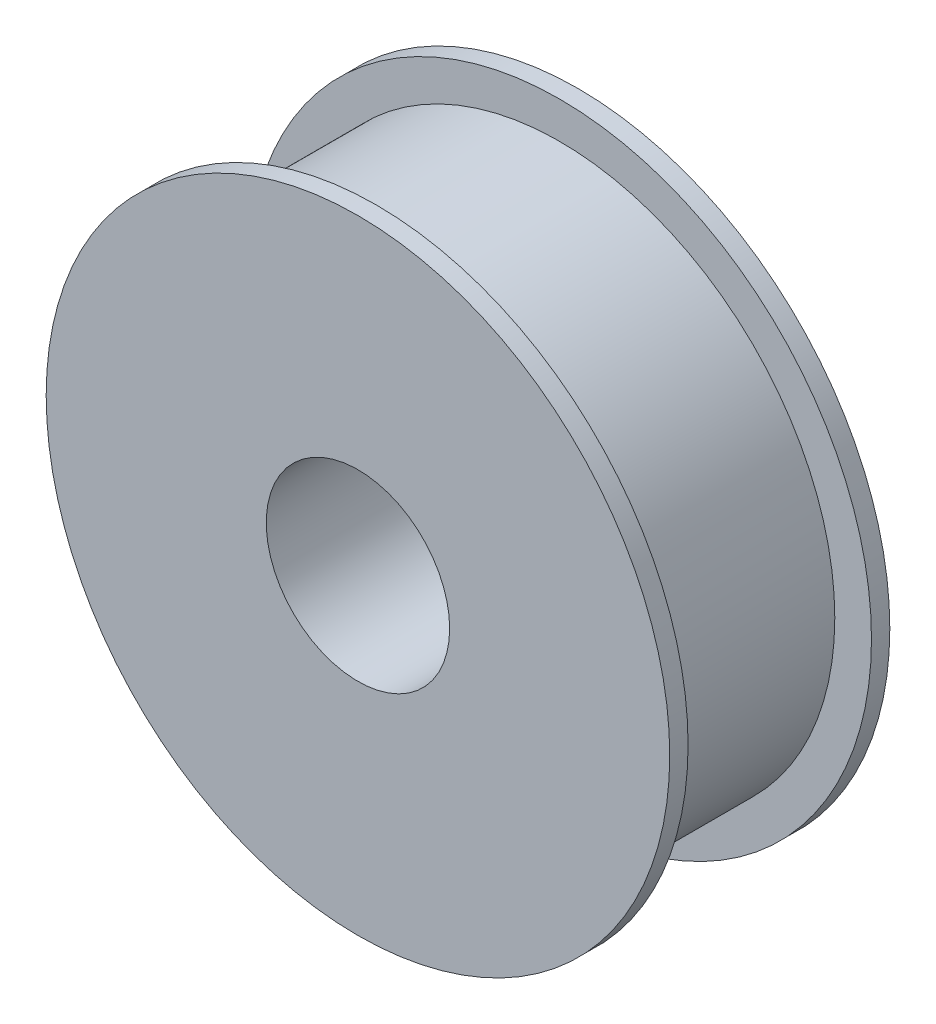
ISO-10303-21;
HEADER;
FILE_DESCRIPTION(('STEP AP214'),'2;1');
FILE_NAME('part.step','',(''),(''),'','','');
FILE_SCHEMA(('AUTOMOTIVE_DESIGN { 1 0 10303 214 1 1 1 1 }'));
ENDSEC;
DATA;
#1=APPLICATION_CONTEXT('core data for automotive mechanical design processes');
#2=APPLICATION_PROTOCOL_DEFINITION('international standard','automotive_design',2000,#1);
#3=PRODUCT_CONTEXT('',#1,'mechanical');
#4=PRODUCT('Part','Part','',(#3));
#5=PRODUCT_RELATED_PRODUCT_CATEGORY('part','',(#4));
#6=PRODUCT_DEFINITION_FORMATION('','',#4);
#7=PRODUCT_DEFINITION_CONTEXT('part definition',#1,'design');
#8=PRODUCT_DEFINITION('design','',#6,#7);
#9=PRODUCT_DEFINITION_SHAPE('','',#8);
#10=(LENGTH_UNIT() NAMED_UNIT(*) SI_UNIT(.MILLI.,.METRE.));
#11=(NAMED_UNIT(*) PLANE_ANGLE_UNIT() SI_UNIT($,.RADIAN.));
#12=(NAMED_UNIT(*) SI_UNIT($,.STERADIAN.) SOLID_ANGLE_UNIT());
#13=UNCERTAINTY_MEASURE_WITH_UNIT(LENGTH_MEASURE(1.E-05),#10,'distance_accuracy_value','');
#14=(GEOMETRIC_REPRESENTATION_CONTEXT(3) GLOBAL_UNCERTAINTY_ASSIGNED_CONTEXT((#13)) GLOBAL_UNIT_ASSIGNED_CONTEXT((#10,
#11,#12)) REPRESENTATION_CONTEXT('',''));
#15=CARTESIAN_POINT('',(0.,0.,0.));
#16=DIRECTION('',(0.,0.,1.));
#17=DIRECTION('',(1.,0.,0.));
#18=AXIS2_PLACEMENT_3D('',#15,#16,#17);
#19=CARTESIAN_POINT('',(0.,17.,6.));
#20=DIRECTION('',(0.,0.,-1.));
#21=DIRECTION('',(-1.,0.,0.));
#22=AXIS2_PLACEMENT_3D('',#19,#20,#21);
#23=PLANE('',#22);
#24=CARTESIAN_POINT('',(0.,0.,6.));
#25=DIRECTION('',(0.,0.,1.));
#26=DIRECTION('',(1.,0.,0.));
#27=AXIS2_PLACEMENT_3D('',#24,#25,#26);
#28=CIRCLE('',#27,5.);
#29=CARTESIAN_POINT('',(5.,0.,6.));
#30=VERTEX_POINT('',#29);
#31=EDGE_CURVE('E60',#30,#30,#28,.T.);
#32=ORIENTED_EDGE('',*,*,#31,.F.);
#33=EDGE_LOOP('',(#32));
#34=FACE_BOUND('',#33,.T.);
#35=CARTESIAN_POINT('',(0.,0.,6.));
#36=DIRECTION('',(0.,0.,1.));
#37=DIRECTION('',(1.,0.,0.));
#38=AXIS2_PLACEMENT_3D('',#35,#36,#37);
#39=CIRCLE('',#38,17.);
#40=CARTESIAN_POINT('',(17.,0.,6.));
#41=VERTEX_POINT('',#40);
#42=EDGE_CURVE('E54',#41,#41,#39,.T.);
#43=ORIENTED_EDGE('',*,*,#42,.T.);
#44=EDGE_LOOP('',(#43));
#45=FACE_BOUND('',#44,.T.);
#46=ADVANCED_FACE('F32',(#34,#45),#23,.F.);
#47=CARTESIAN_POINT('',(0.,17.,-6.));
#48=DIRECTION('',(0.,0.,1.));
#49=DIRECTION('',(1.,0.,0.));
#50=AXIS2_PLACEMENT_3D('',#47,#48,#49);
#51=PLANE('',#50);
#52=CARTESIAN_POINT('',(0.,0.,-6.));
#53=DIRECTION('',(0.,0.,1.));
#54=DIRECTION('',(1.,0.,0.));
#55=AXIS2_PLACEMENT_3D('',#52,#53,#54);
#56=CIRCLE('',#55,5.);
#57=CARTESIAN_POINT('',(5.,0.,-6.));
#58=VERTEX_POINT('',#57);
#59=EDGE_CURVE('E57',#58,#58,#56,.T.);
#60=ORIENTED_EDGE('',*,*,#59,.T.);
#61=EDGE_LOOP('',(#60));
#62=FACE_BOUND('',#61,.T.);
#63=CARTESIAN_POINT('',(0.,0.,-6.));
#64=DIRECTION('',(0.,0.,1.));
#65=DIRECTION('',(1.,0.,0.));
#66=AXIS2_PLACEMENT_3D('',#63,#64,#65);
#67=CIRCLE('',#66,17.);
#68=CARTESIAN_POINT('',(17.,0.,-6.));
#69=VERTEX_POINT('',#68);
#70=EDGE_CURVE('E10',#69,#69,#67,.T.);
#71=ORIENTED_EDGE('',*,*,#70,.F.);
#72=EDGE_LOOP('',(#71));
#73=FACE_BOUND('',#72,.T.);
#74=ADVANCED_FACE('F68',(#62,#73),#51,.F.);
#75=CARTESIAN_POINT('',(0.,0.,6.));
#76=DIRECTION('',(0.,0.,1.));
#77=DIRECTION('',(1.,0.,0.));
#78=AXIS2_PLACEMENT_3D('',#75,#76,#77);
#79=CYLINDRICAL_SURFACE('',#78,17.);
#80=CARTESIAN_POINT('',(0.,0.,-5.));
#81=DIRECTION('',(0.,0.,1.));
#82=DIRECTION('',(1.,0.,0.));
#83=AXIS2_PLACEMENT_3D('',#80,#81,#82);
#84=CIRCLE('',#83,17.);
#85=CARTESIAN_POINT('',(17.,0.,-5.));
#86=VERTEX_POINT('',#85);
#87=EDGE_CURVE('E38',#86,#86,#84,.T.);
#88=ORIENTED_EDGE('',*,*,#87,.F.);
#89=EDGE_LOOP('',(#88));
#90=FACE_BOUND('',#89,.T.);
#91=ORIENTED_EDGE('',*,*,#70,.T.);
#92=EDGE_LOOP('',(#91));
#93=FACE_BOUND('',#92,.T.);
#94=ADVANCED_FACE('F91',(#90,#93),#79,.T.);
#95=CARTESIAN_POINT('',(0.,15.,-5.));
#96=DIRECTION('',(0.,0.,-1.));
#97=DIRECTION('',(-1.,0.,0.));
#98=AXIS2_PLACEMENT_3D('',#95,#96,#97);
#99=PLANE('',#98);
#100=CARTESIAN_POINT('',(0.,0.,-5.));
#101=DIRECTION('',(0.,0.,1.));
#102=DIRECTION('',(1.,0.,0.));
#103=AXIS2_PLACEMENT_3D('',#100,#101,#102);
#104=CIRCLE('',#103,15.);
#105=CARTESIAN_POINT('',(15.,0.,-5.));
#106=VERTEX_POINT('',#105);
#107=EDGE_CURVE('E42',#106,#106,#104,.T.);
#108=ORIENTED_EDGE('',*,*,#107,.F.);
#109=EDGE_LOOP('',(#108));
#110=FACE_BOUND('',#109,.T.);
#111=ORIENTED_EDGE('',*,*,#87,.T.);
#112=EDGE_LOOP('',(#111));
#113=FACE_BOUND('',#112,.T.);
#114=ADVANCED_FACE('F86',(#110,#113),#99,.F.);
#115=CARTESIAN_POINT('',(0.,0.,6.));
#116=DIRECTION('',(0.,0.,1.));
#117=DIRECTION('',(1.,0.,0.));
#118=AXIS2_PLACEMENT_3D('',#115,#116,#117);
#119=CYLINDRICAL_SURFACE('',#118,15.);
#120=CARTESIAN_POINT('',(0.,0.,5.));
#121=DIRECTION('',(0.,0.,1.));
#122=DIRECTION('',(1.,0.,0.));
#123=AXIS2_PLACEMENT_3D('',#120,#121,#122);
#124=CIRCLE('',#123,15.);
#125=CARTESIAN_POINT('',(15.,0.,5.));
#126=VERTEX_POINT('',#125);
#127=EDGE_CURVE('E46',#126,#126,#124,.T.);
#128=ORIENTED_EDGE('',*,*,#127,.F.);
#129=EDGE_LOOP('',(#128));
#130=FACE_BOUND('',#129,.T.);
#131=ORIENTED_EDGE('',*,*,#107,.T.);
#132=EDGE_LOOP('',(#131));
#133=FACE_BOUND('',#132,.T.);
#134=ADVANCED_FACE('F80',(#130,#133),#119,.T.);
#135=CARTESIAN_POINT('',(0.,17.,5.));
#136=DIRECTION('',(0.,0.,1.));
#137=DIRECTION('',(1.,0.,0.));
#138=AXIS2_PLACEMENT_3D('',#135,#136,#137);
#139=PLANE('',#138);
#140=CARTESIAN_POINT('',(0.,0.,5.));
#141=DIRECTION('',(0.,0.,1.));
#142=DIRECTION('',(1.,0.,0.));
#143=AXIS2_PLACEMENT_3D('',#140,#141,#142);
#144=CIRCLE('',#143,17.);
#145=CARTESIAN_POINT('',(17.,0.,5.));
#146=VERTEX_POINT('',#145);
#147=EDGE_CURVE('E51',#146,#146,#144,.T.);
#148=ORIENTED_EDGE('',*,*,#147,.F.);
#149=EDGE_LOOP('',(#148));
#150=FACE_BOUND('',#149,.T.);
#151=ORIENTED_EDGE('',*,*,#127,.T.);
#152=EDGE_LOOP('',(#151));
#153=FACE_BOUND('',#152,.T.);
#154=ADVANCED_FACE('F74',(#150,#153),#139,.F.);
#155=CARTESIAN_POINT('',(0.,0.,6.));
#156=DIRECTION('',(0.,0.,1.));
#157=DIRECTION('',(1.,0.,0.));
#158=AXIS2_PLACEMENT_3D('',#155,#156,#157);
#159=CYLINDRICAL_SURFACE('',#158,17.);
#160=ORIENTED_EDGE('',*,*,#42,.F.);
#161=EDGE_LOOP('',(#160));
#162=FACE_BOUND('',#161,.T.);
#163=ORIENTED_EDGE('',*,*,#147,.T.);
#164=EDGE_LOOP('',(#163));
#165=FACE_BOUND('',#164,.T.);
#166=ADVANCED_FACE('F71',(#162,#165),#159,.T.);
#167=CARTESIAN_POINT('',(0.,0.,-6.));
#168=DIRECTION('',(0.,0.,1.));
#169=DIRECTION('',(1.,0.,0.));
#170=AXIS2_PLACEMENT_3D('',#167,#168,#169);
#171=CYLINDRICAL_SURFACE('',#170,5.);
#172=CARTESIAN_POINT('',(5.,0.,-6.));
#173=CARTESIAN_POINT('',(5.,0.,-5.875));
#174=CARTESIAN_POINT('',(5.,0.,-5.75));
#175=CARTESIAN_POINT('',(5.,0.,-5.5));
#176=CARTESIAN_POINT('',(5.,0.,-5.375));
#177=CARTESIAN_POINT('',(5.,0.,-5.125));
#178=CARTESIAN_POINT('',(5.,0.,-5.));
#179=CARTESIAN_POINT('',(5.,0.,-4.75));
#180=CARTESIAN_POINT('',(5.,0.,-4.625));
#181=CARTESIAN_POINT('',(5.,0.,-4.375));
#182=CARTESIAN_POINT('',(5.,0.,-4.25));
#183=CARTESIAN_POINT('',(5.,0.,-4.));
#184=CARTESIAN_POINT('',(5.,0.,-3.875));
#185=CARTESIAN_POINT('',(5.,0.,-3.625));
#186=CARTESIAN_POINT('',(5.,0.,-3.5));
#187=CARTESIAN_POINT('',(5.,0.,-3.25));
#188=CARTESIAN_POINT('',(5.,0.,-3.125));
#189=CARTESIAN_POINT('',(5.,0.,-2.875));
#190=CARTESIAN_POINT('',(5.,0.,-2.75));
#191=CARTESIAN_POINT('',(5.,0.,-2.5));
#192=CARTESIAN_POINT('',(5.,0.,-2.375));
#193=CARTESIAN_POINT('',(5.,0.,-2.125));
#194=CARTESIAN_POINT('',(5.,0.,-2.));
#195=CARTESIAN_POINT('',(5.,0.,-1.75));
#196=CARTESIAN_POINT('',(5.,0.,-1.625));
#197=CARTESIAN_POINT('',(5.,0.,-1.375));
#198=CARTESIAN_POINT('',(5.,0.,-1.25));
#199=CARTESIAN_POINT('',(5.,0.,-1.));
#200=CARTESIAN_POINT('',(5.,0.,-0.875000000000001));
#201=CARTESIAN_POINT('',(5.,0.,-0.625000000000001));
#202=CARTESIAN_POINT('',(5.,0.,-0.500000000000001));
#203=CARTESIAN_POINT('',(5.,0.,-0.250000000000001));
#204=CARTESIAN_POINT('',(5.,0.,-0.125000000000001));
#205=CARTESIAN_POINT('',(5.,0.,0.124999999999999));
#206=CARTESIAN_POINT('',(5.,0.,0.249999999999999));
#207=CARTESIAN_POINT('',(5.,0.,0.5));
#208=CARTESIAN_POINT('',(5.,0.,0.625));
#209=CARTESIAN_POINT('',(5.,0.,0.875));
#210=CARTESIAN_POINT('',(5.,0.,0.999999999999999));
#211=CARTESIAN_POINT('',(5.,0.,1.25));
#212=CARTESIAN_POINT('',(5.,0.,1.375));
#213=CARTESIAN_POINT('',(5.,0.,1.625));
#214=CARTESIAN_POINT('',(5.,0.,1.75));
#215=CARTESIAN_POINT('',(5.,0.,2.));
#216=CARTESIAN_POINT('',(5.,0.,2.125));
#217=CARTESIAN_POINT('',(5.,0.,2.375));
#218=CARTESIAN_POINT('',(5.,0.,2.5));
#219=CARTESIAN_POINT('',(5.,0.,2.75));
#220=CARTESIAN_POINT('',(5.,0.,2.875));
#221=CARTESIAN_POINT('',(5.,0.,3.125));
#222=CARTESIAN_POINT('',(5.,0.,3.25));
#223=CARTESIAN_POINT('',(5.,0.,3.5));
#224=CARTESIAN_POINT('',(5.,0.,3.625));
#225=CARTESIAN_POINT('',(5.,0.,3.875));
#226=CARTESIAN_POINT('',(5.,0.,4.));
#227=CARTESIAN_POINT('',(5.,0.,4.25));
#228=CARTESIAN_POINT('',(5.,0.,4.375));
#229=CARTESIAN_POINT('',(5.,0.,4.625));
#230=CARTESIAN_POINT('',(5.,0.,4.75));
#231=CARTESIAN_POINT('',(5.,0.,5.));
#232=CARTESIAN_POINT('',(5.,0.,5.125));
#233=CARTESIAN_POINT('',(5.,0.,5.375));
#234=CARTESIAN_POINT('',(5.,0.,5.5));
#235=CARTESIAN_POINT('',(5.,0.,5.75));
#236=CARTESIAN_POINT('',(5.,0.,5.875));
#237=CARTESIAN_POINT('',(5.,0.,6.));
#238=B_SPLINE_CURVE_WITH_KNOTS('',3,(#172,#173,#174,#175,#176,#177,#178,#179,#180,#181,#182,
#183,#184,#185,#186,#187,#188,#189,#190,#191,#192,#193,#194,#195,#196,#197,#198,#199,#200,#201,
#202,#203,#204,#205,#206,#207,#208,#209,#210,#211,#212,#213,#214,#215,#216,#217,#218,#219,#220,
#221,#222,#223,#224,#225,#226,#227,#228,#229,#230,#231,#232,#233,#234,#235,#236,#237),
.UNSPECIFIED.,.F.,.F.,(4,2,2,2,2,2,2,2,2,2,2,2,2,2,2,2,2,2,2,2,2,2,2,2,2,2,2,2,2,2,2,2,4),(0.,
0.375,0.750000000000001,1.125,1.5,1.875,2.25,2.625,3.,3.375,3.75,4.125,4.5,4.875,5.25,5.625,6.,
6.375,6.75,7.125,7.5,7.875,8.25,8.625,9.,9.375,9.75,10.125,10.5,10.875,11.25,11.625,12.),.UNSPECIFIED.);
#239=EDGE_CURVE('BSEAM64',#58,#30,#238,.T.);
#240=ORIENTED_EDGE('',*,*,#59,.F.);
#241=ORIENTED_EDGE('',*,*,#31,.T.);
#242=ORIENTED_EDGE('',*,*,#239,.T.);
#243=ORIENTED_EDGE('',*,*,#239,.F.);
#244=EDGE_LOOP('',(#240,#242,#241,#243));
#245=FACE_BOUND('',#244,.T.);
#246=ADVANCED_FACE('F64',(#245),#171,.F.);
#247=CLOSED_SHELL('',(#46,#74,#94,#114,#134,#154,#166,#246));
#248=MANIFOLD_SOLID_BREP('B2',#247);
#249=ADVANCED_BREP_SHAPE_REPRESENTATION('',(#18,#248),#14);
#250=SHAPE_DEFINITION_REPRESENTATION(#9,#249);
ENDSEC;
END-ISO-10303-21;
